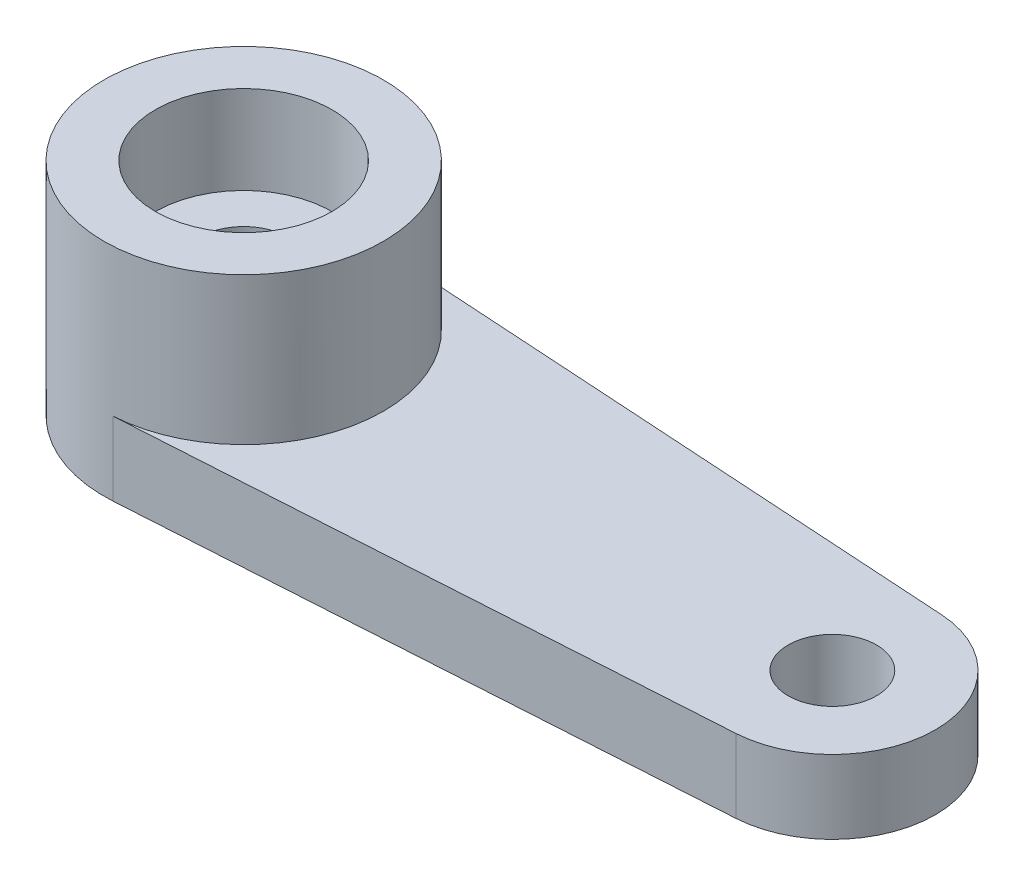
ISO-10303-21;
HEADER;
FILE_DESCRIPTION(('STEP AP214'),'2;1');
FILE_NAME('part.step','',(''),(''),'','','');
FILE_SCHEMA(('AUTOMOTIVE_DESIGN { 1 0 10303 214 1 1 1 1 }'));
ENDSEC;
DATA;
#1=APPLICATION_CONTEXT('core data for automotive mechanical design processes');
#2=APPLICATION_PROTOCOL_DEFINITION('international standard','automotive_design',2000,#1);
#3=PRODUCT_CONTEXT('',#1,'mechanical');
#4=PRODUCT('Part','Part','',(#3));
#5=PRODUCT_RELATED_PRODUCT_CATEGORY('part','',(#4));
#6=PRODUCT_DEFINITION_FORMATION('','',#4);
#7=PRODUCT_DEFINITION_CONTEXT('part definition',#1,'design');
#8=PRODUCT_DEFINITION('design','',#6,#7);
#9=PRODUCT_DEFINITION_SHAPE('','',#8);
#10=(LENGTH_UNIT() NAMED_UNIT(*) SI_UNIT(.MILLI.,.METRE.));
#11=(NAMED_UNIT(*) PLANE_ANGLE_UNIT() SI_UNIT($,.RADIAN.));
#12=(NAMED_UNIT(*) SI_UNIT($,.STERADIAN.) SOLID_ANGLE_UNIT());
#13=UNCERTAINTY_MEASURE_WITH_UNIT(LENGTH_MEASURE(1.E-05),#10,'distance_accuracy_value','');
#14=(GEOMETRIC_REPRESENTATION_CONTEXT(3) GLOBAL_UNCERTAINTY_ASSIGNED_CONTEXT((#13)) GLOBAL_UNIT_ASSIGNED_CONTEXT((#10,
#11,#12)) REPRESENTATION_CONTEXT('',''));
#15=CARTESIAN_POINT('',(0.,0.,0.));
#16=DIRECTION('',(0.,0.,1.));
#17=DIRECTION('',(1.,0.,0.));
#18=AXIS2_PLACEMENT_3D('',#15,#16,#17);
#19=CARTESIAN_POINT('',(0.,2.5,0.));
#20=DIRECTION('',(0.,1.,0.));
#21=DIRECTION('',(0.,0.,1.));
#22=AXIS2_PLACEMENT_3D('',#19,#20,#21);
#23=PLANE('',#22);
#24=CARTESIAN_POINT('',(0.,2.5,0.));
#25=DIRECTION('',(0.,1.,0.));
#26=DIRECTION('',(0.,0.,1.));
#27=AXIS2_PLACEMENT_3D('',#24,#25,#26);
#28=CIRCLE('',#27,4.75);
#29=CARTESIAN_POINT('',(0.296875,2.5,4.74071357860554));
#30=VERTEX_POINT('',#29);
#31=CARTESIAN_POINT('',(0.296875,2.5,-4.74071357860554));
#32=VERTEX_POINT('',#31);
#33=EDGE_CURVE('E87',#30,#32,#28,.T.);
#34=ORIENTED_EDGE('',*,*,#33,.F.);
#35=DIRECTION('',(0.998044963916957,0.,-0.0625));
#36=VECTOR('',#35,1.);
#37=CARTESIAN_POINT('',(0.296875,2.5,4.74071357860554));
#38=LINE('',#37,#36);
#39=CARTESIAN_POINT('',(20.21875,2.5,3.49315737370935));
#40=VERTEX_POINT('',#39);
#41=EDGE_CURVE('E79',#30,#40,#38,.T.);
#42=ORIENTED_EDGE('',*,*,#41,.T.);
#43=CARTESIAN_POINT('',(20.,2.5,0.));
#44=DIRECTION('',(0.,1.,0.));
#45=DIRECTION('',(0.,0.,-1.));
#46=AXIS2_PLACEMENT_3D('',#43,#44,#45);
#47=CIRCLE('',#46,3.5);
#48=CARTESIAN_POINT('',(20.21875,2.5,-3.49315737370935));
#49=VERTEX_POINT('',#48);
#50=EDGE_CURVE('E93',#40,#49,#47,.T.);
#51=ORIENTED_EDGE('',*,*,#50,.T.);
#52=DIRECTION('',(-0.998044963916957,0.,-0.0625));
#53=VECTOR('',#52,1.);
#54=CARTESIAN_POINT('',(0.296875,2.5,-4.74071357860554));
#55=LINE('',#54,#53);
#56=EDGE_CURVE('E52',#49,#32,#55,.T.);
#57=ORIENTED_EDGE('',*,*,#56,.T.);
#58=EDGE_LOOP('',(#34,#42,#51,#57));
#59=FACE_BOUND('',#58,.T.);
#60=CARTESIAN_POINT('',(20.,2.5,0.));
#61=DIRECTION('',(0.,1.,0.));
#62=DIRECTION('',(0.,0.,1.));
#63=AXIS2_PLACEMENT_3D('',#60,#61,#62);
#64=CIRCLE('',#63,1.5);
#65=CARTESIAN_POINT('',(20.,2.5,1.5));
#66=VERTEX_POINT('',#65);
#67=EDGE_CURVE('E107',#66,#66,#64,.T.);
#68=ORIENTED_EDGE('',*,*,#67,.F.);
#69=EDGE_LOOP('',(#68));
#70=FACE_BOUND('',#69,.T.);
#71=ADVANCED_FACE('F34',(#59,#70),#23,.T.);
#72=CARTESIAN_POINT('',(0.,0.,0.));
#73=DIRECTION('',(0.,1.,0.));
#74=DIRECTION('',(0.,0.,1.));
#75=AXIS2_PLACEMENT_3D('',#72,#73,#74);
#76=PLANE('',#75);
#77=CARTESIAN_POINT('',(0.,0.,0.));
#78=DIRECTION('',(0.,1.,0.));
#79=DIRECTION('',(0.,0.,1.));
#80=AXIS2_PLACEMENT_3D('',#77,#78,#79);
#81=CIRCLE('',#80,4.75);
#82=CARTESIAN_POINT('',(0.296875,0.,-4.74071357860554));
#83=VERTEX_POINT('',#82);
#84=CARTESIAN_POINT('',(0.296875,0.,4.74071357860554));
#85=VERTEX_POINT('',#84);
#86=EDGE_CURVE('E89',#83,#85,#81,.T.);
#87=ORIENTED_EDGE('',*,*,#86,.F.);
#88=DIRECTION('',(-0.998044963916957,0.,-0.0625));
#89=VECTOR('',#88,1.);
#90=CARTESIAN_POINT('',(0.296875,0.,-4.74071357860554));
#91=LINE('',#90,#89);
#92=CARTESIAN_POINT('',(20.21875,0.,-3.49315737370935));
#93=VERTEX_POINT('',#92);
#94=EDGE_CURVE('E75',#93,#83,#91,.T.);
#95=ORIENTED_EDGE('',*,*,#94,.F.);
#96=CARTESIAN_POINT('',(20.,0.,0.));
#97=DIRECTION('',(0.,1.,0.));
#98=DIRECTION('',(0.,0.,-1.));
#99=AXIS2_PLACEMENT_3D('',#96,#97,#98);
#100=CIRCLE('',#99,3.5);
#101=CARTESIAN_POINT('',(20.21875,0.,3.49315737370935));
#102=VERTEX_POINT('',#101);
#103=EDGE_CURVE('E70',#102,#93,#100,.T.);
#104=ORIENTED_EDGE('',*,*,#103,.F.);
#105=DIRECTION('',(0.998044963916957,0.,-0.0625));
#106=VECTOR('',#105,1.);
#107=CARTESIAN_POINT('',(0.296875,0.,4.74071357860554));
#108=LINE('',#107,#106);
#109=EDGE_CURVE('E122',#85,#102,#108,.T.);
#110=ORIENTED_EDGE('',*,*,#109,.F.);
#111=EDGE_LOOP('',(#87,#95,#104,#110));
#112=FACE_BOUND('',#111,.T.);
#113=CARTESIAN_POINT('',(0.,0.,0.));
#114=DIRECTION('',(0.,1.,0.));
#115=DIRECTION('',(0.,0.,1.));
#116=AXIS2_PLACEMENT_3D('',#113,#114,#115);
#117=CIRCLE('',#116,3.);
#118=CARTESIAN_POINT('',(0.,0.,3.));
#119=VERTEX_POINT('',#118);
#120=EDGE_CURVE('E110',#119,#119,#117,.T.);
#121=ORIENTED_EDGE('',*,*,#120,.T.);
#122=EDGE_LOOP('',(#121));
#123=FACE_BOUND('',#122,.T.);
#124=CARTESIAN_POINT('',(20.,0.,0.));
#125=DIRECTION('',(0.,1.,0.));
#126=DIRECTION('',(0.,0.,1.));
#127=AXIS2_PLACEMENT_3D('',#124,#125,#126);
#128=CIRCLE('',#127,1.5);
#129=CARTESIAN_POINT('',(20.,0.,1.5));
#130=VERTEX_POINT('',#129);
#131=EDGE_CURVE('E111',#130,#130,#128,.T.);
#132=ORIENTED_EDGE('',*,*,#131,.T.);
#133=EDGE_LOOP('',(#132));
#134=FACE_BOUND('',#133,.T.);
#135=ADVANCED_FACE('F131',(#112,#123,#134),#76,.F.);
#136=CARTESIAN_POINT('',(0.,2.5,0.));
#137=DIRECTION('',(0.,-1.,0.));
#138=DIRECTION('',(0.,0.,-1.));
#139=AXIS2_PLACEMENT_3D('',#136,#137,#138);
#140=CYLINDRICAL_SURFACE('',#139,4.75);
#141=ORIENTED_EDGE('',*,*,#86,.T.);
#142=DIRECTION('',(0.,-1.,0.));
#143=VECTOR('',#142,1.);
#144=CARTESIAN_POINT('',(0.296875,2.5,4.74071357860554));
#145=LINE('',#144,#143);
#146=EDGE_CURVE('E11',#30,#85,#145,.T.);
#147=ORIENTED_EDGE('',*,*,#146,.F.);
#148=ORIENTED_EDGE('',*,*,#33,.T.);
#149=DIRECTION('',(0.,-1.,0.));
#150=VECTOR('',#149,1.);
#151=CARTESIAN_POINT('',(0.296875,2.5,-4.74071357860554));
#152=LINE('',#151,#150);
#153=EDGE_CURVE('E120',#32,#83,#152,.T.);
#154=ORIENTED_EDGE('',*,*,#153,.T.);
#155=EDGE_LOOP('',(#141,#147,#148,#154));
#156=FACE_BOUND('',#155,.T.);
#157=CARTESIAN_POINT('',(0.,7.5,0.));
#158=DIRECTION('',(0.,1.,0.));
#159=DIRECTION('',(0.,0.,1.));
#160=AXIS2_PLACEMENT_3D('',#157,#158,#159);
#161=CIRCLE('',#160,4.75);
#162=CARTESIAN_POINT('',(0.,7.5,4.75));
#163=VERTEX_POINT('',#162);
#164=EDGE_CURVE('E96',#163,#163,#161,.T.);
#165=ORIENTED_EDGE('',*,*,#164,.F.);
#166=EDGE_LOOP('',(#165));
#167=FACE_BOUND('',#166,.T.);
#168=ADVANCED_FACE('F36',(#156,#167),#140,.T.);
#169=CARTESIAN_POINT('',(0.296875,2.5,4.74071357860554));
#170=DIRECTION('',(-0.0625,0.,-0.998044963916957));
#171=DIRECTION('',(-0.998044963916957,0.,0.0625));
#172=AXIS2_PLACEMENT_3D('',#169,#170,#171);
#173=PLANE('',#172);
#174=ORIENTED_EDGE('',*,*,#109,.T.);
#175=DIRECTION('',(0.,-1.,0.));
#176=VECTOR('',#175,1.);
#177=CARTESIAN_POINT('',(20.21875,2.5,3.49315737370935));
#178=LINE('',#177,#176);
#179=EDGE_CURVE('E44',#40,#102,#178,.T.);
#180=ORIENTED_EDGE('',*,*,#179,.F.);
#181=ORIENTED_EDGE('',*,*,#41,.F.);
#182=ORIENTED_EDGE('',*,*,#146,.T.);
#183=EDGE_LOOP('',(#174,#180,#181,#182));
#184=FACE_BOUND('',#183,.T.);
#185=ADVANCED_FACE('F91',(#184),#173,.F.);
#186=CARTESIAN_POINT('',(20.,2.5,0.));
#187=DIRECTION('',(0.,-1.,0.));
#188=DIRECTION('',(0.,0.,-1.));
#189=AXIS2_PLACEMENT_3D('',#186,#187,#188);
#190=CYLINDRICAL_SURFACE('',#189,3.5);
#191=ORIENTED_EDGE('',*,*,#103,.T.);
#192=DIRECTION('',(0.,-1.,0.));
#193=VECTOR('',#192,1.);
#194=CARTESIAN_POINT('',(20.21875,2.5,-3.49315737370935));
#195=LINE('',#194,#193);
#196=EDGE_CURVE('E127',#49,#93,#195,.T.);
#197=ORIENTED_EDGE('',*,*,#196,.F.);
#198=ORIENTED_EDGE('',*,*,#50,.F.);
#199=ORIENTED_EDGE('',*,*,#179,.T.);
#200=EDGE_LOOP('',(#191,#197,#198,#199));
#201=FACE_BOUND('',#200,.T.);
#202=ADVANCED_FACE('F129',(#201),#190,.T.);
#203=CARTESIAN_POINT('',(0.296875,2.5,-4.74071357860554));
#204=DIRECTION('',(-0.0625,0.,0.998044963916957));
#205=DIRECTION('',(0.998044963916957,0.,0.0625));
#206=AXIS2_PLACEMENT_3D('',#203,#204,#205);
#207=PLANE('',#206);
#208=ORIENTED_EDGE('',*,*,#94,.T.);
#209=ORIENTED_EDGE('',*,*,#153,.F.);
#210=ORIENTED_EDGE('',*,*,#56,.F.);
#211=ORIENTED_EDGE('',*,*,#196,.T.);
#212=EDGE_LOOP('',(#208,#209,#210,#211));
#213=FACE_BOUND('',#212,.T.);
#214=ADVANCED_FACE('F152',(#213),#207,.F.);
#215=CARTESIAN_POINT('',(0.,2.5,0.));
#216=DIRECTION('',(0.,-1.,0.));
#217=DIRECTION('',(0.,0.,-1.));
#218=AXIS2_PLACEMENT_3D('',#215,#216,#217);
#219=CYLINDRICAL_SURFACE('',#218,3.);
#220=CARTESIAN_POINT('',(0.,2.5,0.));
#221=DIRECTION('',(0.,1.,0.));
#222=DIRECTION('',(0.,0.,1.));
#223=AXIS2_PLACEMENT_3D('',#220,#221,#222);
#224=CIRCLE('',#223,3.);
#225=CARTESIAN_POINT('',(0.,2.5,3.));
#226=VERTEX_POINT('',#225);
#227=EDGE_CURVE('E100',#226,#226,#224,.T.);
#228=ORIENTED_EDGE('',*,*,#227,.T.);
#229=EDGE_LOOP('',(#228));
#230=FACE_BOUND('',#229,.T.);
#231=ORIENTED_EDGE('',*,*,#120,.F.);
#232=EDGE_LOOP('',(#231));
#233=FACE_BOUND('',#232,.T.);
#234=ADVANCED_FACE('F142',(#230,#233),#219,.F.);
#235=CARTESIAN_POINT('',(20.,2.5,0.));
#236=DIRECTION('',(0.,-1.,0.));
#237=DIRECTION('',(0.,0.,-1.));
#238=AXIS2_PLACEMENT_3D('',#235,#236,#237);
#239=CYLINDRICAL_SURFACE('',#238,1.5);
#240=ORIENTED_EDGE('',*,*,#67,.T.);
#241=EDGE_LOOP('',(#240));
#242=FACE_BOUND('',#241,.T.);
#243=ORIENTED_EDGE('',*,*,#131,.F.);
#244=EDGE_LOOP('',(#243));
#245=FACE_BOUND('',#244,.T.);
#246=ADVANCED_FACE('F139',(#242,#245),#239,.F.);
#247=CARTESIAN_POINT('',(0.,7.5,0.));
#248=DIRECTION('',(0.,1.,0.));
#249=DIRECTION('',(0.,0.,1.));
#250=AXIS2_PLACEMENT_3D('',#247,#248,#249);
#251=PLANE('',#250);
#252=CARTESIAN_POINT('',(0.,7.5,0.));
#253=DIRECTION('',(0.,1.,0.));
#254=DIRECTION('',(0.,0.,1.));
#255=AXIS2_PLACEMENT_3D('',#252,#253,#254);
#256=CIRCLE('',#255,3.);
#257=CARTESIAN_POINT('',(0.,7.5,3.));
#258=VERTEX_POINT('',#257);
#259=EDGE_CURVE('E103',#258,#258,#256,.T.);
#260=ORIENTED_EDGE('',*,*,#259,.F.);
#261=EDGE_LOOP('',(#260));
#262=FACE_BOUND('',#261,.T.);
#263=ORIENTED_EDGE('',*,*,#164,.T.);
#264=EDGE_LOOP('',(#263));
#265=FACE_BOUND('',#264,.T.);
#266=ADVANCED_FACE('F141',(#262,#265),#251,.T.);
#267=CARTESIAN_POINT('',(0.,2.5,0.));
#268=DIRECTION('',(0.,1.,0.));
#269=DIRECTION('',(0.,0.,1.));
#270=AXIS2_PLACEMENT_3D('',#267,#268,#269);
#271=PLANE('',#270);
#272=CARTESIAN_POINT('',(0.,2.5,0.));
#273=DIRECTION('',(0.,-1.,0.));
#274=DIRECTION('',(0.,0.,-1.));
#275=AXIS2_PLACEMENT_3D('',#272,#273,#274);
#276=CIRCLE('',#275,1.5);
#277=CARTESIAN_POINT('',(0.,2.5,-1.5));
#278=VERTEX_POINT('',#277);
#279=EDGE_CURVE('E256',#278,#278,#276,.T.);
#280=ORIENTED_EDGE('',*,*,#279,.F.);
#281=EDGE_LOOP('',(#280));
#282=FACE_BOUND('',#281,.T.);
#283=ORIENTED_EDGE('',*,*,#227,.F.);
#284=EDGE_LOOP('',(#283));
#285=FACE_BOUND('',#284,.T.);
#286=ADVANCED_FACE('F149',(#282,#285),#271,.F.);
#287=CARTESIAN_POINT('',(0.,4.5,0.));
#288=DIRECTION('',(0.,1.,0.));
#289=DIRECTION('',(0.,0.,1.));
#290=AXIS2_PLACEMENT_3D('',#287,#288,#289);
#291=CYLINDRICAL_SURFACE('',#290,3.);
#292=CARTESIAN_POINT('',(0.,4.5,0.));
#293=DIRECTION('',(0.,1.,0.));
#294=DIRECTION('',(0.,0.,1.));
#295=AXIS2_PLACEMENT_3D('',#292,#293,#294);
#296=CIRCLE('',#295,3.);
#297=CARTESIAN_POINT('',(0.,4.5,3.));
#298=VERTEX_POINT('',#297);
#299=EDGE_CURVE('E97',#298,#298,#296,.T.);
#300=ORIENTED_EDGE('',*,*,#299,.F.);
#301=EDGE_LOOP('',(#300));
#302=FACE_BOUND('',#301,.T.);
#303=ORIENTED_EDGE('',*,*,#259,.T.);
#304=EDGE_LOOP('',(#303));
#305=FACE_BOUND('',#304,.T.);
#306=ADVANCED_FACE('F221',(#302,#305),#291,.F.);
#307=CARTESIAN_POINT('',(0.,4.5,0.));
#308=DIRECTION('',(0.,1.,0.));
#309=DIRECTION('',(0.,0.,1.));
#310=AXIS2_PLACEMENT_3D('',#307,#308,#309);
#311=PLANE('',#310);
#312=CARTESIAN_POINT('',(0.,4.5,0.));
#313=DIRECTION('',(0.,1.,0.));
#314=DIRECTION('',(0.,0.,1.));
#315=AXIS2_PLACEMENT_3D('',#312,#313,#314);
#316=CIRCLE('',#315,1.5);
#317=CARTESIAN_POINT('',(0.,4.5,1.5));
#318=VERTEX_POINT('',#317);
#319=EDGE_CURVE('E38',#318,#318,#316,.T.);
#320=ORIENTED_EDGE('',*,*,#319,.F.);
#321=EDGE_LOOP('',(#320));
#322=FACE_BOUND('',#321,.T.);
#323=ORIENTED_EDGE('',*,*,#299,.T.);
#324=EDGE_LOOP('',(#323));
#325=FACE_BOUND('',#324,.T.);
#326=ADVANCED_FACE('F228',(#322,#325),#311,.T.);
#327=CARTESIAN_POINT('',(0.,5.5,0.));
#328=DIRECTION('',(0.,-1.,0.));
#329=DIRECTION('',(0.,0.,-1.));
#330=AXIS2_PLACEMENT_3D('',#327,#328,#329);
#331=CYLINDRICAL_SURFACE('',#330,1.5);
#332=ORIENTED_EDGE('',*,*,#319,.T.);
#333=EDGE_LOOP('',(#332));
#334=FACE_BOUND('',#333,.T.);
#335=ORIENTED_EDGE('',*,*,#279,.T.);
#336=EDGE_LOOP('',(#335));
#337=FACE_BOUND('',#336,.T.);
#338=ADVANCED_FACE('F237',(#334,#337),#331,.F.);
#339=CLOSED_SHELL('',(#71,#135,#168,#185,#202,#214,#234,#246,#266,#286,#306,#326,#338));
#340=MANIFOLD_SOLID_BREP('B2',#339);
#341=ADVANCED_BREP_SHAPE_REPRESENTATION('',(#18,#340),#14);
#342=SHAPE_DEFINITION_REPRESENTATION(#9,#341);
ENDSEC;
END-ISO-10303-21;
